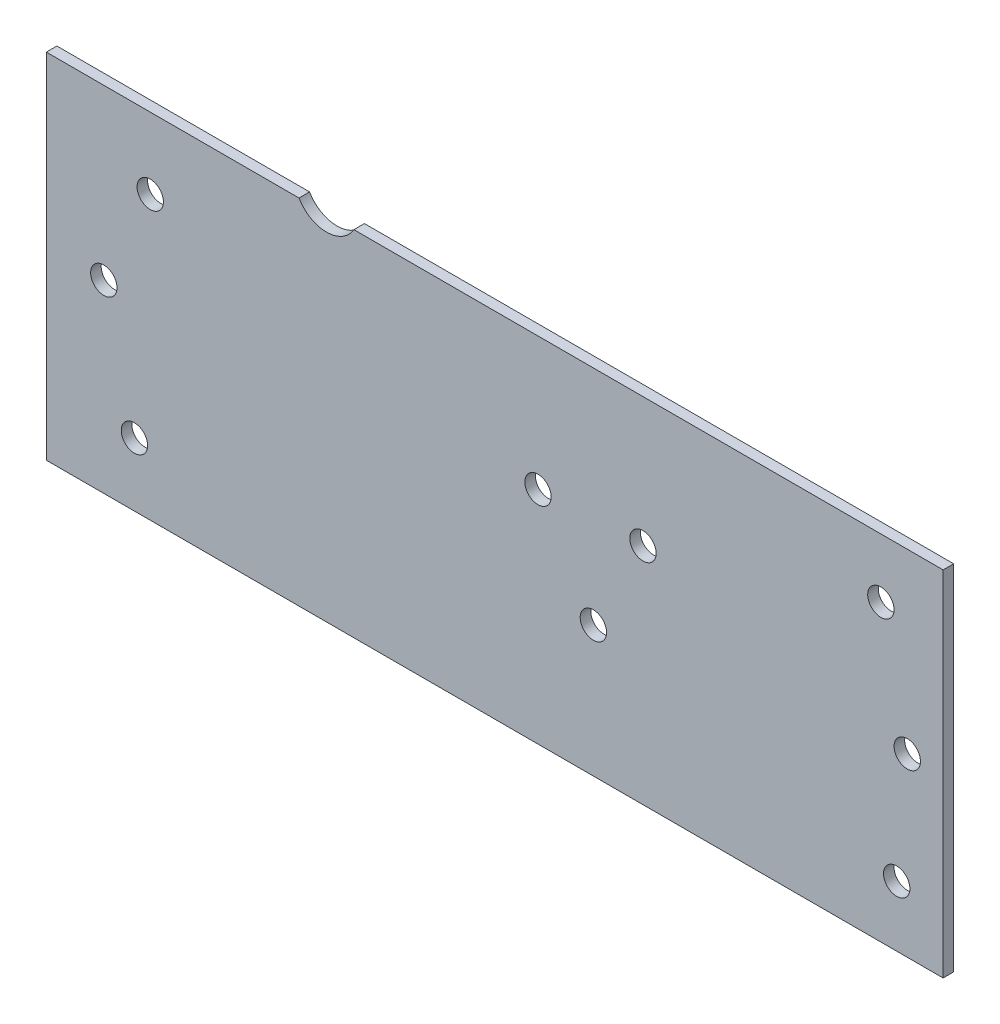
ISO-10303-21;
HEADER;
FILE_DESCRIPTION(('STEP AP214'),'2;1');
FILE_NAME('part.step','',(''),(''),'','','');
FILE_SCHEMA(('AUTOMOTIVE_DESIGN { 1 0 10303 214 1 1 1 1 }'));
ENDSEC;
DATA;
#1=APPLICATION_CONTEXT('core data for automotive mechanical design processes');
#2=APPLICATION_PROTOCOL_DEFINITION('international standard','automotive_design',2000,#1);
#3=PRODUCT_CONTEXT('',#1,'mechanical');
#4=PRODUCT('Part','Part','',(#3));
#5=PRODUCT_RELATED_PRODUCT_CATEGORY('part','',(#4));
#6=PRODUCT_DEFINITION_FORMATION('','',#4);
#7=PRODUCT_DEFINITION_CONTEXT('part definition',#1,'design');
#8=PRODUCT_DEFINITION('design','',#6,#7);
#9=PRODUCT_DEFINITION_SHAPE('','',#8);
#10=(LENGTH_UNIT() NAMED_UNIT(*) SI_UNIT(.MILLI.,.METRE.));
#11=(NAMED_UNIT(*) PLANE_ANGLE_UNIT() SI_UNIT($,.RADIAN.));
#12=(NAMED_UNIT(*) SI_UNIT($,.STERADIAN.) SOLID_ANGLE_UNIT());
#13=UNCERTAINTY_MEASURE_WITH_UNIT(LENGTH_MEASURE(1.E-05),#10,'distance_accuracy_value','');
#14=(GEOMETRIC_REPRESENTATION_CONTEXT(3) GLOBAL_UNCERTAINTY_ASSIGNED_CONTEXT((#13)) GLOBAL_UNIT_ASSIGNED_CONTEXT((#10,
#11,#12)) REPRESENTATION_CONTEXT('',''));
#15=CARTESIAN_POINT('',(0.,0.,0.));
#16=DIRECTION('',(0.,0.,1.));
#17=DIRECTION('',(1.,0.,0.));
#18=AXIS2_PLACEMENT_3D('',#15,#16,#17);
#19=CARTESIAN_POINT('',(-31.9,36.5,2.));
#20=DIRECTION('',(0.,0.,-1.));
#21=DIRECTION('',(-1.,0.,0.));
#22=AXIS2_PLACEMENT_3D('',#19,#20,#21);
#23=CYLINDRICAL_SURFACE('',#22,6.);
#24=CARTESIAN_POINT('',(-31.9,36.5,0.));
#25=DIRECTION('',(0.,0.,1.));
#26=DIRECTION('',(1.,0.,0.));
#27=AXIS2_PLACEMENT_3D('',#24,#25,#26);
#28=CIRCLE('',#27,6.);
#29=CARTESIAN_POINT('',(-37.0961524227066,33.5,0.));
#30=VERTEX_POINT('',#29);
#31=CARTESIAN_POINT('',(-26.7038475772934,33.5,0.));
#32=VERTEX_POINT('',#31);
#33=EDGE_CURVE('E165',#30,#32,#28,.T.);
#34=ORIENTED_EDGE('',*,*,#33,.F.);
#35=DIRECTION('',(0.,0.,-1.));
#36=VECTOR('',#35,1.);
#37=CARTESIAN_POINT('',(-37.0961524227066,33.5,2.));
#38=LINE('',#37,#36);
#39=CARTESIAN_POINT('',(-37.0961524227066,33.5,2.));
#40=VERTEX_POINT('',#39);
#41=EDGE_CURVE('E11',#40,#30,#38,.T.);
#42=ORIENTED_EDGE('',*,*,#41,.F.);
#43=CARTESIAN_POINT('',(-31.9,36.5,2.));
#44=DIRECTION('',(0.,0.,1.));
#45=DIRECTION('',(1.,0.,0.));
#46=AXIS2_PLACEMENT_3D('',#43,#44,#45);
#47=CIRCLE('',#46,6.);
#48=CARTESIAN_POINT('',(-26.7038475772934,33.5,2.));
#49=VERTEX_POINT('',#48);
#50=EDGE_CURVE('E218',#40,#49,#47,.T.);
#51=ORIENTED_EDGE('',*,*,#50,.T.);
#52=DIRECTION('',(0.,0.,-1.));
#53=VECTOR('',#52,1.);
#54=CARTESIAN_POINT('',(-26.7038475772934,33.5,2.));
#55=LINE('',#54,#53);
#56=EDGE_CURVE('E58',#49,#32,#55,.T.);
#57=ORIENTED_EDGE('',*,*,#56,.T.);
#58=EDGE_LOOP('',(#34,#42,#51,#57));
#59=FACE_BOUND('',#58,.T.);
#60=ADVANCED_FACE('F41',(#59),#23,.F.);
#61=CARTESIAN_POINT('',(0.,33.5,2.));
#62=DIRECTION('',(0.,1.,0.));
#63=DIRECTION('',(0.,0.,1.));
#64=AXIS2_PLACEMENT_3D('',#61,#62,#63);
#65=PLANE('',#64);
#66=DIRECTION('',(1.,0.,0.));
#67=VECTOR('',#66,1.);
#68=CARTESIAN_POINT('',(0.,33.5,0.));
#69=LINE('',#68,#67);
#70=CARTESIAN_POINT('',(-85.,33.5,0.));
#71=VERTEX_POINT('',#70);
#72=EDGE_CURVE('E168',#71,#30,#69,.T.);
#73=ORIENTED_EDGE('',*,*,#72,.F.);
#74=DIRECTION('',(0.,0.,-1.));
#75=VECTOR('',#74,1.);
#76=CARTESIAN_POINT('',(-85.,33.5,2.));
#77=LINE('',#76,#75);
#78=CARTESIAN_POINT('',(-85.,33.5,2.));
#79=VERTEX_POINT('',#78);
#80=EDGE_CURVE('E50',#79,#71,#77,.T.);
#81=ORIENTED_EDGE('',*,*,#80,.F.);
#82=DIRECTION('',(1.,0.,0.));
#83=VECTOR('',#82,1.);
#84=CARTESIAN_POINT('',(0.,33.5,2.));
#85=LINE('',#84,#83);
#86=EDGE_CURVE('E127',#79,#40,#85,.T.);
#87=ORIENTED_EDGE('',*,*,#86,.T.);
#88=ORIENTED_EDGE('',*,*,#41,.T.);
#89=EDGE_LOOP('',(#73,#81,#87,#88));
#90=FACE_BOUND('',#89,.T.);
#91=ADVANCED_FACE('F231',(#90),#65,.T.);
#92=CARTESIAN_POINT('',(-85.,0.,2.));
#93=DIRECTION('',(-1.,0.,0.));
#94=DIRECTION('',(0.,0.,1.));
#95=AXIS2_PLACEMENT_3D('',#92,#93,#94);
#96=PLANE('',#95);
#97=DIRECTION('',(0.,1.,0.));
#98=VECTOR('',#97,1.);
#99=CARTESIAN_POINT('',(-85.,0.,0.));
#100=LINE('',#99,#98);
#101=CARTESIAN_POINT('',(-85.,-33.5,0.));
#102=VERTEX_POINT('',#101);
#103=EDGE_CURVE('E172',#102,#71,#100,.T.);
#104=ORIENTED_EDGE('',*,*,#103,.F.);
#105=DIRECTION('',(0.,0.,-1.));
#106=VECTOR('',#105,1.);
#107=CARTESIAN_POINT('',(-85.,-33.5,2.));
#108=LINE('',#107,#106);
#109=CARTESIAN_POINT('',(-85.,-33.5,2.));
#110=VERTEX_POINT('',#109);
#111=EDGE_CURVE('E118',#110,#102,#108,.T.);
#112=ORIENTED_EDGE('',*,*,#111,.F.);
#113=DIRECTION('',(0.,1.,0.));
#114=VECTOR('',#113,1.);
#115=CARTESIAN_POINT('',(-85.,0.,2.));
#116=LINE('',#115,#114);
#117=EDGE_CURVE('E106',#110,#79,#116,.T.);
#118=ORIENTED_EDGE('',*,*,#117,.T.);
#119=ORIENTED_EDGE('',*,*,#80,.T.);
#120=EDGE_LOOP('',(#104,#112,#118,#119));
#121=FACE_BOUND('',#120,.T.);
#122=ADVANCED_FACE('F228',(#121),#96,.T.);
#123=CARTESIAN_POINT('',(0.,-33.5,2.));
#124=DIRECTION('',(0.,1.,0.));
#125=DIRECTION('',(0.,0.,1.));
#126=AXIS2_PLACEMENT_3D('',#123,#124,#125);
#127=PLANE('',#126);
#128=DIRECTION('',(1.,0.,0.));
#129=VECTOR('',#128,1.);
#130=CARTESIAN_POINT('',(0.,-33.5,0.));
#131=LINE('',#130,#129);
#132=CARTESIAN_POINT('',(85.,-33.5,0.));
#133=VERTEX_POINT('',#132);
#134=EDGE_CURVE('E114',#102,#133,#131,.T.);
#135=ORIENTED_EDGE('',*,*,#134,.T.);
#136=DIRECTION('',(0.,0.,-1.));
#137=VECTOR('',#136,1.);
#138=CARTESIAN_POINT('',(85.,-33.5,2.));
#139=LINE('',#138,#137);
#140=CARTESIAN_POINT('',(85.,-33.5,2.));
#141=VERTEX_POINT('',#140);
#142=EDGE_CURVE('E111',#141,#133,#139,.T.);
#143=ORIENTED_EDGE('',*,*,#142,.F.);
#144=DIRECTION('',(1.,0.,0.));
#145=VECTOR('',#144,1.);
#146=CARTESIAN_POINT('',(0.,-33.5,2.));
#147=LINE('',#146,#145);
#148=EDGE_CURVE('E97',#110,#141,#147,.T.);
#149=ORIENTED_EDGE('',*,*,#148,.F.);
#150=ORIENTED_EDGE('',*,*,#111,.T.);
#151=EDGE_LOOP('',(#135,#143,#149,#150));
#152=FACE_BOUND('',#151,.T.);
#153=ADVANCED_FACE('F112',(#152),#127,.F.);
#154=CARTESIAN_POINT('',(85.,0.,2.));
#155=DIRECTION('',(-1.,0.,0.));
#156=DIRECTION('',(0.,0.,1.));
#157=AXIS2_PLACEMENT_3D('',#154,#155,#156);
#158=PLANE('',#157);
#159=DIRECTION('',(0.,1.,0.));
#160=VECTOR('',#159,1.);
#161=CARTESIAN_POINT('',(85.,0.,0.));
#162=LINE('',#161,#160);
#163=CARTESIAN_POINT('',(85.,33.5,0.));
#164=VERTEX_POINT('',#163);
#165=EDGE_CURVE('E179',#133,#164,#162,.T.);
#166=ORIENTED_EDGE('',*,*,#165,.T.);
#167=DIRECTION('',(0.,0.,-1.));
#168=VECTOR('',#167,1.);
#169=CARTESIAN_POINT('',(85.,33.5,2.));
#170=LINE('',#169,#168);
#171=CARTESIAN_POINT('',(85.,33.5,2.));
#172=VERTEX_POINT('',#171);
#173=EDGE_CURVE('E78',#172,#164,#170,.T.);
#174=ORIENTED_EDGE('',*,*,#173,.F.);
#175=DIRECTION('',(0.,1.,0.));
#176=VECTOR('',#175,1.);
#177=CARTESIAN_POINT('',(85.,0.,2.));
#178=LINE('',#177,#176);
#179=EDGE_CURVE('E103',#141,#172,#178,.T.);
#180=ORIENTED_EDGE('',*,*,#179,.F.);
#181=ORIENTED_EDGE('',*,*,#142,.T.);
#182=EDGE_LOOP('',(#166,#174,#180,#181));
#183=FACE_BOUND('',#182,.T.);
#184=ADVANCED_FACE('F120',(#183),#158,.F.);
#185=CARTESIAN_POINT('',(28.1,9.,2.));
#186=DIRECTION('',(0.,0.,-1.));
#187=DIRECTION('',(-1.,0.,0.));
#188=AXIS2_PLACEMENT_3D('',#185,#186,#187);
#189=CYLINDRICAL_SURFACE('',#188,2.5);
#190=CARTESIAN_POINT('',(28.1,9.,2.));
#191=DIRECTION('',(0.,0.,1.));
#192=DIRECTION('',(1.,0.,0.));
#193=AXIS2_PLACEMENT_3D('',#190,#191,#192);
#194=CIRCLE('',#193,2.5);
#195=CARTESIAN_POINT('',(30.6,9.,2.));
#196=VERTEX_POINT('',#195);
#197=EDGE_CURVE('E157',#196,#196,#194,.T.);
#198=ORIENTED_EDGE('',*,*,#197,.T.);
#199=EDGE_LOOP('',(#198));
#200=FACE_BOUND('',#199,.T.);
#201=CARTESIAN_POINT('',(28.1,9.,0.));
#202=DIRECTION('',(0.,0.,1.));
#203=DIRECTION('',(1.,0.,0.));
#204=AXIS2_PLACEMENT_3D('',#201,#202,#203);
#205=CIRCLE('',#204,2.5);
#206=CARTESIAN_POINT('',(30.6,9.,0.));
#207=VERTEX_POINT('',#206);
#208=EDGE_CURVE('E210',#207,#207,#205,.T.);
#209=ORIENTED_EDGE('',*,*,#208,.F.);
#210=EDGE_LOOP('',(#209));
#211=FACE_BOUND('',#210,.T.);
#212=ADVANCED_FACE('F289',(#200,#211),#189,.F.);
#213=CARTESIAN_POINT('',(18.7,-8.7,2.));
#214=DIRECTION('',(0.,0.,-1.));
#215=DIRECTION('',(-1.,0.,0.));
#216=AXIS2_PLACEMENT_3D('',#213,#214,#215);
#217=CYLINDRICAL_SURFACE('',#216,2.5);
#218=CARTESIAN_POINT('',(18.7,-8.7,2.));
#219=DIRECTION('',(0.,0.,1.));
#220=DIRECTION('',(1.,0.,0.));
#221=AXIS2_PLACEMENT_3D('',#218,#219,#220);
#222=CIRCLE('',#221,2.5);
#223=CARTESIAN_POINT('',(21.2,-8.7,2.));
#224=VERTEX_POINT('',#223);
#225=EDGE_CURVE('E153',#224,#224,#222,.T.);
#226=ORIENTED_EDGE('',*,*,#225,.T.);
#227=EDGE_LOOP('',(#226));
#228=FACE_BOUND('',#227,.T.);
#229=CARTESIAN_POINT('',(18.7,-8.7,0.));
#230=DIRECTION('',(0.,0.,1.));
#231=DIRECTION('',(1.,0.,0.));
#232=AXIS2_PLACEMENT_3D('',#229,#230,#231);
#233=CIRCLE('',#232,2.5);
#234=CARTESIAN_POINT('',(21.2,-8.7,0.));
#235=VERTEX_POINT('',#234);
#236=EDGE_CURVE('E206',#235,#235,#233,.T.);
#237=ORIENTED_EDGE('',*,*,#236,.F.);
#238=EDGE_LOOP('',(#237));
#239=FACE_BOUND('',#238,.T.);
#240=ADVANCED_FACE('F285',(#228,#239),#217,.F.);
#241=CARTESIAN_POINT('',(73.2,22.3,2.));
#242=DIRECTION('',(0.,0.,-1.));
#243=DIRECTION('',(-1.,0.,0.));
#244=AXIS2_PLACEMENT_3D('',#241,#242,#243);
#245=CYLINDRICAL_SURFACE('',#244,2.50000000000001);
#246=CARTESIAN_POINT('',(73.2,22.3,2.));
#247=DIRECTION('',(0.,0.,1.));
#248=DIRECTION('',(1.,0.,0.));
#249=AXIS2_PLACEMENT_3D('',#246,#247,#248);
#250=CIRCLE('',#249,2.50000000000001);
#251=CARTESIAN_POINT('',(75.7,22.3,2.));
#252=VERTEX_POINT('',#251);
#253=EDGE_CURVE('E149',#252,#252,#250,.T.);
#254=ORIENTED_EDGE('',*,*,#253,.T.);
#255=EDGE_LOOP('',(#254));
#256=FACE_BOUND('',#255,.T.);
#257=CARTESIAN_POINT('',(73.2,22.3,0.));
#258=DIRECTION('',(0.,0.,1.));
#259=DIRECTION('',(1.,0.,0.));
#260=AXIS2_PLACEMENT_3D('',#257,#258,#259);
#261=CIRCLE('',#260,2.50000000000001);
#262=CARTESIAN_POINT('',(75.7,22.3,0.));
#263=VERTEX_POINT('',#262);
#264=EDGE_CURVE('E202',#263,#263,#261,.T.);
#265=ORIENTED_EDGE('',*,*,#264,.F.);
#266=EDGE_LOOP('',(#265));
#267=FACE_BOUND('',#266,.T.);
#268=ADVANCED_FACE('F281',(#256,#267),#245,.F.);
#269=CARTESIAN_POINT('',(78.2,-0.100000000000003,2.));
#270=DIRECTION('',(0.,0.,-1.));
#271=DIRECTION('',(-1.,0.,0.));
#272=AXIS2_PLACEMENT_3D('',#269,#270,#271);
#273=CYLINDRICAL_SURFACE('',#272,2.49999999999999);
#274=CARTESIAN_POINT('',(78.2,-0.100000000000003,2.));
#275=DIRECTION('',(0.,0.,1.));
#276=DIRECTION('',(1.,0.,0.));
#277=AXIS2_PLACEMENT_3D('',#274,#275,#276);
#278=CIRCLE('',#277,2.49999999999999);
#279=CARTESIAN_POINT('',(80.7,-0.100000000000003,2.));
#280=VERTEX_POINT('',#279);
#281=EDGE_CURVE('E145',#280,#280,#278,.T.);
#282=ORIENTED_EDGE('',*,*,#281,.T.);
#283=EDGE_LOOP('',(#282));
#284=FACE_BOUND('',#283,.T.);
#285=CARTESIAN_POINT('',(78.2,-0.100000000000003,0.));
#286=DIRECTION('',(0.,0.,1.));
#287=DIRECTION('',(1.,0.,0.));
#288=AXIS2_PLACEMENT_3D('',#285,#286,#287);
#289=CIRCLE('',#288,2.49999999999999);
#290=CARTESIAN_POINT('',(80.7,-0.100000000000003,0.));
#291=VERTEX_POINT('',#290);
#292=EDGE_CURVE('E198',#291,#291,#289,.T.);
#293=ORIENTED_EDGE('',*,*,#292,.F.);
#294=EDGE_LOOP('',(#293));
#295=FACE_BOUND('',#294,.T.);
#296=ADVANCED_FACE('F277',(#284,#295),#273,.F.);
#297=CARTESIAN_POINT('',(76.2,-22.,2.));
#298=DIRECTION('',(0.,0.,-1.));
#299=DIRECTION('',(-1.,0.,0.));
#300=AXIS2_PLACEMENT_3D('',#297,#298,#299);
#301=CYLINDRICAL_SURFACE('',#300,2.49999999999999);
#302=CARTESIAN_POINT('',(76.2,-22.,2.));
#303=DIRECTION('',(0.,0.,1.));
#304=DIRECTION('',(1.,0.,0.));
#305=AXIS2_PLACEMENT_3D('',#302,#303,#304);
#306=CIRCLE('',#305,2.49999999999999);
#307=CARTESIAN_POINT('',(78.7,-22.,2.));
#308=VERTEX_POINT('',#307);
#309=EDGE_CURVE('E141',#308,#308,#306,.T.);
#310=ORIENTED_EDGE('',*,*,#309,.T.);
#311=EDGE_LOOP('',(#310));
#312=FACE_BOUND('',#311,.T.);
#313=CARTESIAN_POINT('',(76.2,-22.,0.));
#314=DIRECTION('',(0.,0.,1.));
#315=DIRECTION('',(1.,0.,0.));
#316=AXIS2_PLACEMENT_3D('',#313,#314,#315);
#317=CIRCLE('',#316,2.49999999999999);
#318=CARTESIAN_POINT('',(78.7,-22.,0.));
#319=VERTEX_POINT('',#318);
#320=EDGE_CURVE('E194',#319,#319,#317,.T.);
#321=ORIENTED_EDGE('',*,*,#320,.F.);
#322=EDGE_LOOP('',(#321));
#323=FACE_BOUND('',#322,.T.);
#324=ADVANCED_FACE('F273',(#312,#323),#301,.F.);
#325=CARTESIAN_POINT('',(-68.3,-21.5,2.));
#326=DIRECTION('',(0.,0.,-1.));
#327=DIRECTION('',(-1.,0.,0.));
#328=AXIS2_PLACEMENT_3D('',#325,#326,#327);
#329=CYLINDRICAL_SURFACE('',#328,2.49999999999999);
#330=CARTESIAN_POINT('',(-68.3,-21.5,2.));
#331=DIRECTION('',(0.,0.,1.));
#332=DIRECTION('',(1.,0.,0.));
#333=AXIS2_PLACEMENT_3D('',#330,#331,#332);
#334=CIRCLE('',#333,2.49999999999999);
#335=CARTESIAN_POINT('',(-65.8,-21.5,2.));
#336=VERTEX_POINT('',#335);
#337=EDGE_CURVE('E137',#336,#336,#334,.T.);
#338=ORIENTED_EDGE('',*,*,#337,.T.);
#339=EDGE_LOOP('',(#338));
#340=FACE_BOUND('',#339,.T.);
#341=CARTESIAN_POINT('',(-68.3,-21.5,0.));
#342=DIRECTION('',(0.,0.,1.));
#343=DIRECTION('',(1.,0.,0.));
#344=AXIS2_PLACEMENT_3D('',#341,#342,#343);
#345=CIRCLE('',#344,2.49999999999999);
#346=CARTESIAN_POINT('',(-65.8,-21.5,0.));
#347=VERTEX_POINT('',#346);
#348=EDGE_CURVE('E190',#347,#347,#345,.T.);
#349=ORIENTED_EDGE('',*,*,#348,.F.);
#350=EDGE_LOOP('',(#349));
#351=FACE_BOUND('',#350,.T.);
#352=ADVANCED_FACE('F266',(#340,#351),#329,.F.);
#353=CARTESIAN_POINT('',(-74.1,1.5,2.));
#354=DIRECTION('',(0.,0.,-1.));
#355=DIRECTION('',(-1.,0.,0.));
#356=AXIS2_PLACEMENT_3D('',#353,#354,#355);
#357=CYLINDRICAL_SURFACE('',#356,2.49999999999999);
#358=CARTESIAN_POINT('',(-74.1,1.5,2.));
#359=DIRECTION('',(0.,0.,1.));
#360=DIRECTION('',(1.,0.,0.));
#361=AXIS2_PLACEMENT_3D('',#358,#359,#360);
#362=CIRCLE('',#361,2.49999999999999);
#363=CARTESIAN_POINT('',(-71.6,1.5,2.));
#364=VERTEX_POINT('',#363);
#365=EDGE_CURVE('E133',#364,#364,#362,.T.);
#366=ORIENTED_EDGE('',*,*,#365,.T.);
#367=EDGE_LOOP('',(#366));
#368=FACE_BOUND('',#367,.T.);
#369=CARTESIAN_POINT('',(-74.1,1.5,0.));
#370=DIRECTION('',(0.,0.,1.));
#371=DIRECTION('',(1.,0.,0.));
#372=AXIS2_PLACEMENT_3D('',#369,#370,#371);
#373=CIRCLE('',#372,2.49999999999999);
#374=CARTESIAN_POINT('',(-71.6,1.5,0.));
#375=VERTEX_POINT('',#374);
#376=EDGE_CURVE('E186',#375,#375,#373,.T.);
#377=ORIENTED_EDGE('',*,*,#376,.F.);
#378=EDGE_LOOP('',(#377));
#379=FACE_BOUND('',#378,.T.);
#380=ADVANCED_FACE('F261',(#368,#379),#357,.F.);
#381=CARTESIAN_POINT('',(-65.3,20.,2.));
#382=DIRECTION('',(0.,0.,-1.));
#383=DIRECTION('',(-1.,0.,0.));
#384=AXIS2_PLACEMENT_3D('',#381,#382,#383);
#385=CYLINDRICAL_SURFACE('',#384,2.5);
#386=CARTESIAN_POINT('',(-65.3,20.,2.));
#387=DIRECTION('',(0.,0.,1.));
#388=DIRECTION('',(1.,0.,0.));
#389=AXIS2_PLACEMENT_3D('',#386,#387,#388);
#390=CIRCLE('',#389,2.5);
#391=CARTESIAN_POINT('',(-62.8,20.,2.));
#392=VERTEX_POINT('',#391);
#393=EDGE_CURVE('E125',#392,#392,#390,.T.);
#394=ORIENTED_EDGE('',*,*,#393,.T.);
#395=EDGE_LOOP('',(#394));
#396=FACE_BOUND('',#395,.T.);
#397=CARTESIAN_POINT('',(-65.3,20.,0.));
#398=DIRECTION('',(0.,0.,1.));
#399=DIRECTION('',(1.,0.,0.));
#400=AXIS2_PLACEMENT_3D('',#397,#398,#399);
#401=CIRCLE('',#400,2.5);
#402=CARTESIAN_POINT('',(-62.8,20.,0.));
#403=VERTEX_POINT('',#402);
#404=EDGE_CURVE('E182',#403,#403,#401,.T.);
#405=ORIENTED_EDGE('',*,*,#404,.F.);
#406=EDGE_LOOP('',(#405));
#407=FACE_BOUND('',#406,.T.);
#408=ADVANCED_FACE('F254',(#396,#407),#385,.F.);
#409=EDGE_CURVE('E173',#32,#164,#69,.T.);
#410=ORIENTED_EDGE('',*,*,#409,.F.);
#411=ORIENTED_EDGE('',*,*,#56,.F.);
#412=EDGE_CURVE('E122',#49,#172,#85,.T.);
#413=ORIENTED_EDGE('',*,*,#412,.T.);
#414=ORIENTED_EDGE('',*,*,#173,.T.);
#415=EDGE_LOOP('',(#410,#411,#413,#414));
#416=FACE_BOUND('',#415,.T.);
#417=ADVANCED_FACE('F246',(#416),#65,.T.);
#418=CARTESIAN_POINT('',(8.20000000000003,8.3,2.));
#419=DIRECTION('',(0.,0.,-1.));
#420=DIRECTION('',(-1.,0.,0.));
#421=AXIS2_PLACEMENT_3D('',#418,#419,#420);
#422=CYLINDRICAL_SURFACE('',#421,2.5);
#423=CARTESIAN_POINT('',(8.20000000000003,8.3,2.));
#424=DIRECTION('',(0.,0.,1.));
#425=DIRECTION('',(1.,0.,0.));
#426=AXIS2_PLACEMENT_3D('',#423,#424,#425);
#427=CIRCLE('',#426,2.5);
#428=CARTESIAN_POINT('',(10.7,8.3,2.));
#429=VERTEX_POINT('',#428);
#430=EDGE_CURVE('E161',#429,#429,#427,.T.);
#431=ORIENTED_EDGE('',*,*,#430,.T.);
#432=EDGE_LOOP('',(#431));
#433=FACE_BOUND('',#432,.T.);
#434=CARTESIAN_POINT('',(8.20000000000003,8.3,0.));
#435=DIRECTION('',(0.,0.,1.));
#436=DIRECTION('',(1.,0.,0.));
#437=AXIS2_PLACEMENT_3D('',#434,#435,#436);
#438=CIRCLE('',#437,2.5);
#439=CARTESIAN_POINT('',(10.7,8.3,0.));
#440=VERTEX_POINT('',#439);
#441=EDGE_CURVE('E214',#440,#440,#438,.T.);
#442=ORIENTED_EDGE('',*,*,#441,.F.);
#443=EDGE_LOOP('',(#442));
#444=FACE_BOUND('',#443,.T.);
#445=ADVANCED_FACE('F253',(#433,#444),#422,.F.);
#446=CARTESIAN_POINT('',(0.,0.,2.));
#447=DIRECTION('',(0.,0.,1.));
#448=DIRECTION('',(1.,0.,0.));
#449=AXIS2_PLACEMENT_3D('',#446,#447,#448);
#450=PLANE('',#449);
#451=ORIENTED_EDGE('',*,*,#50,.F.);
#452=ORIENTED_EDGE('',*,*,#86,.F.);
#453=ORIENTED_EDGE('',*,*,#117,.F.);
#454=ORIENTED_EDGE('',*,*,#148,.T.);
#455=ORIENTED_EDGE('',*,*,#179,.T.);
#456=ORIENTED_EDGE('',*,*,#412,.F.);
#457=EDGE_LOOP('',(#451,#452,#453,#454,#455,#456));
#458=FACE_BOUND('',#457,.T.);
#459=ORIENTED_EDGE('',*,*,#393,.F.);
#460=EDGE_LOOP('',(#459));
#461=FACE_BOUND('',#460,.T.);
#462=ORIENTED_EDGE('',*,*,#365,.F.);
#463=EDGE_LOOP('',(#462));
#464=FACE_BOUND('',#463,.T.);
#465=ORIENTED_EDGE('',*,*,#337,.F.);
#466=EDGE_LOOP('',(#465));
#467=FACE_BOUND('',#466,.T.);
#468=ORIENTED_EDGE('',*,*,#309,.F.);
#469=EDGE_LOOP('',(#468));
#470=FACE_BOUND('',#469,.T.);
#471=ORIENTED_EDGE('',*,*,#281,.F.);
#472=EDGE_LOOP('',(#471));
#473=FACE_BOUND('',#472,.T.);
#474=ORIENTED_EDGE('',*,*,#253,.F.);
#475=EDGE_LOOP('',(#474));
#476=FACE_BOUND('',#475,.T.);
#477=ORIENTED_EDGE('',*,*,#225,.F.);
#478=EDGE_LOOP('',(#477));
#479=FACE_BOUND('',#478,.T.);
#480=ORIENTED_EDGE('',*,*,#197,.F.);
#481=EDGE_LOOP('',(#480));
#482=FACE_BOUND('',#481,.T.);
#483=ORIENTED_EDGE('',*,*,#430,.F.);
#484=EDGE_LOOP('',(#483));
#485=FACE_BOUND('',#484,.T.);
#486=ADVANCED_FACE('F99',(#458,#461,#464,#467,#470,#473,#476,#479,#482,#485),#450,.T.);
#487=CARTESIAN_POINT('',(0.,0.,0.));
#488=DIRECTION('',(0.,0.,1.));
#489=DIRECTION('',(1.,0.,0.));
#490=AXIS2_PLACEMENT_3D('',#487,#488,#489);
#491=PLANE('',#490);
#492=ORIENTED_EDGE('',*,*,#33,.T.);
#493=ORIENTED_EDGE('',*,*,#409,.T.);
#494=ORIENTED_EDGE('',*,*,#165,.F.);
#495=ORIENTED_EDGE('',*,*,#134,.F.);
#496=ORIENTED_EDGE('',*,*,#103,.T.);
#497=ORIENTED_EDGE('',*,*,#72,.T.);
#498=EDGE_LOOP('',(#492,#493,#494,#495,#496,#497));
#499=FACE_BOUND('',#498,.T.);
#500=ORIENTED_EDGE('',*,*,#404,.T.);
#501=EDGE_LOOP('',(#500));
#502=FACE_BOUND('',#501,.T.);
#503=ORIENTED_EDGE('',*,*,#376,.T.);
#504=EDGE_LOOP('',(#503));
#505=FACE_BOUND('',#504,.T.);
#506=ORIENTED_EDGE('',*,*,#348,.T.);
#507=EDGE_LOOP('',(#506));
#508=FACE_BOUND('',#507,.T.);
#509=ORIENTED_EDGE('',*,*,#320,.T.);
#510=EDGE_LOOP('',(#509));
#511=FACE_BOUND('',#510,.T.);
#512=ORIENTED_EDGE('',*,*,#292,.T.);
#513=EDGE_LOOP('',(#512));
#514=FACE_BOUND('',#513,.T.);
#515=ORIENTED_EDGE('',*,*,#264,.T.);
#516=EDGE_LOOP('',(#515));
#517=FACE_BOUND('',#516,.T.);
#518=ORIENTED_EDGE('',*,*,#236,.T.);
#519=EDGE_LOOP('',(#518));
#520=FACE_BOUND('',#519,.T.);
#521=ORIENTED_EDGE('',*,*,#208,.T.);
#522=EDGE_LOOP('',(#521));
#523=FACE_BOUND('',#522,.T.);
#524=ORIENTED_EDGE('',*,*,#441,.T.);
#525=EDGE_LOOP('',(#524));
#526=FACE_BOUND('',#525,.T.);
#527=ADVANCED_FACE('F233',(#499,#502,#505,#508,#511,#514,#517,#520,#523,#526),#491,.F.);
#528=CLOSED_SHELL('',(#60,#91,#122,#153,#184,#212,#240,#268,#296,#324,#352,#380,#408,#417,#445,
#486,#527));
#529=MANIFOLD_SOLID_BREP('B2',#528);
#530=ADVANCED_BREP_SHAPE_REPRESENTATION('',(#18,#529),#14);
#531=SHAPE_DEFINITION_REPRESENTATION(#9,#530);
ENDSEC;
END-ISO-10303-21;
